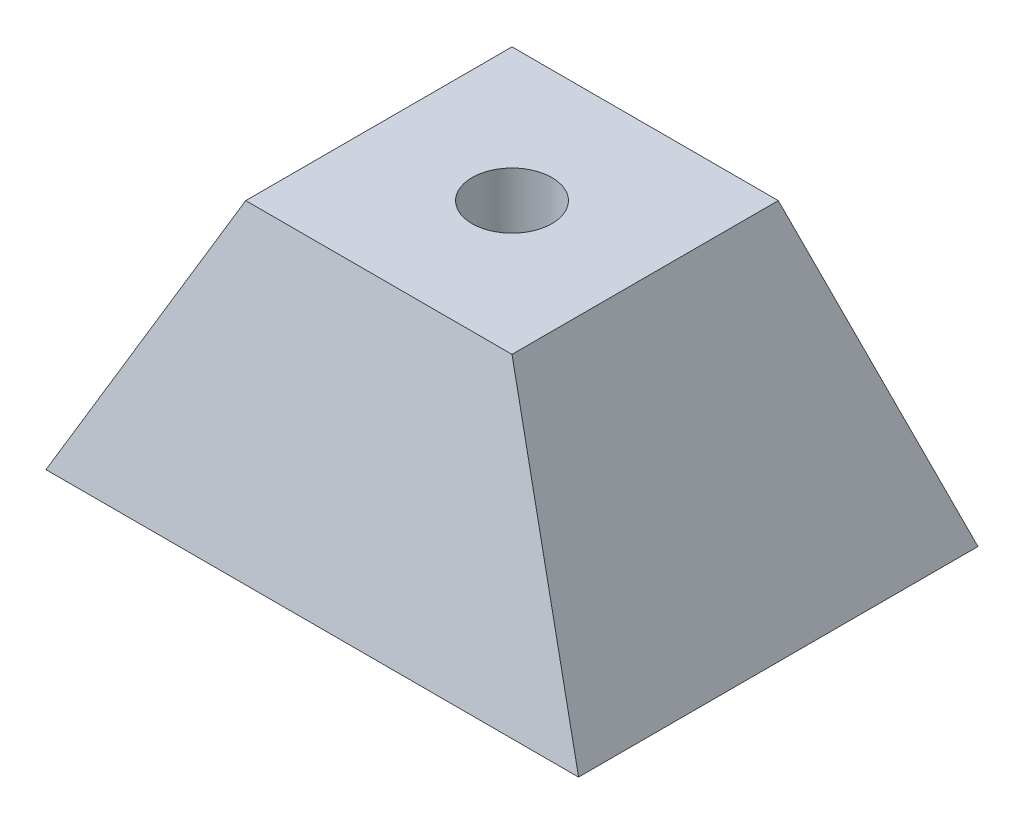
ISO-10303-21;
HEADER;
FILE_DESCRIPTION(('STEP AP214'),'2;1');
FILE_NAME('part.step','',(''),(''),'','','');
FILE_SCHEMA(('AUTOMOTIVE_DESIGN { 1 0 10303 214 1 1 1 1 }'));
ENDSEC;
DATA;
#1=APPLICATION_CONTEXT('core data for automotive mechanical design processes');
#2=APPLICATION_PROTOCOL_DEFINITION('international standard','automotive_design',2000,#1);
#3=PRODUCT_CONTEXT('',#1,'mechanical');
#4=PRODUCT('Part','Part','',(#3));
#5=PRODUCT_RELATED_PRODUCT_CATEGORY('part','',(#4));
#6=PRODUCT_DEFINITION_FORMATION('','',#4);
#7=PRODUCT_DEFINITION_CONTEXT('part definition',#1,'design');
#8=PRODUCT_DEFINITION('design','',#6,#7);
#9=PRODUCT_DEFINITION_SHAPE('','',#8);
#10=(LENGTH_UNIT() NAMED_UNIT(*) SI_UNIT(.MILLI.,.METRE.));
#11=(NAMED_UNIT(*) PLANE_ANGLE_UNIT() SI_UNIT($,.RADIAN.));
#12=(NAMED_UNIT(*) SI_UNIT($,.STERADIAN.) SOLID_ANGLE_UNIT());
#13=UNCERTAINTY_MEASURE_WITH_UNIT(LENGTH_MEASURE(1.E-05),#10,'distance_accuracy_value','');
#14=(GEOMETRIC_REPRESENTATION_CONTEXT(3) GLOBAL_UNCERTAINTY_ASSIGNED_CONTEXT((#13)) GLOBAL_UNIT_ASSIGNED_CONTEXT((#10,
#11,#12)) REPRESENTATION_CONTEXT('',''));
#15=CARTESIAN_POINT('',(0.,0.,0.));
#16=DIRECTION('',(0.,0.,1.));
#17=DIRECTION('',(1.,0.,0.));
#18=AXIS2_PLACEMENT_3D('',#15,#16,#17);
#19=CARTESIAN_POINT('',(0.,0.,0.));
#20=DIRECTION('',(0.,-1.,0.));
#21=DIRECTION('',(0.,0.,-1.));
#22=AXIS2_PLACEMENT_3D('',#19,#20,#21);
#23=PLANE('',#22);
#24=CARTESIAN_POINT('',(0.,0.,0.));
#25=DIRECTION('',(0.,-1.,0.));
#26=DIRECTION('',(0.,0.,-1.));
#27=AXIS2_PLACEMENT_3D('',#24,#25,#26);
#28=CIRCLE('',#27,1.905);
#29=CARTESIAN_POINT('',(0.,0.,-1.905));
#30=VERTEX_POINT('',#29);
#31=EDGE_CURVE('E279',#30,#30,#28,.T.);
#32=ORIENTED_EDGE('',*,*,#31,.F.);
#33=EDGE_LOOP('',(#32));
#34=FACE_BOUND('',#33,.T.);
#35=DIRECTION('',(0.,0.,-1.));
#36=VECTOR('',#35,1.);
#37=CARTESIAN_POINT('',(12.7,0.,9.525));
#38=LINE('',#37,#36);
#39=CARTESIAN_POINT('',(12.7,0.,9.525));
#40=VERTEX_POINT('',#39);
#41=CARTESIAN_POINT('',(12.7,0.,-9.525));
#42=VERTEX_POINT('',#41);
#43=EDGE_CURVE('E170',#40,#42,#38,.T.);
#44=ORIENTED_EDGE('',*,*,#43,.F.);
#45=DIRECTION('',(1.,0.,0.));
#46=VECTOR('',#45,1.);
#47=CARTESIAN_POINT('',(-12.7,0.,9.525));
#48=LINE('',#47,#46);
#49=CARTESIAN_POINT('',(-12.7,0.,9.525));
#50=VERTEX_POINT('',#49);
#51=EDGE_CURVE('E12',#50,#40,#48,.T.);
#52=ORIENTED_EDGE('',*,*,#51,.F.);
#53=DIRECTION('',(0.,0.,1.));
#54=VECTOR('',#53,1.);
#55=CARTESIAN_POINT('',(-12.7,0.,9.525));
#56=LINE('',#55,#54);
#57=CARTESIAN_POINT('',(-12.7,0.,-9.525));
#58=VERTEX_POINT('',#57);
#59=EDGE_CURVE('E57',#58,#50,#56,.T.);
#60=ORIENTED_EDGE('',*,*,#59,.F.);
#61=DIRECTION('',(-1.,0.,0.));
#62=VECTOR('',#61,1.);
#63=CARTESIAN_POINT('',(-12.7,0.,-9.525));
#64=LINE('',#63,#62);
#65=EDGE_CURVE('E190',#42,#58,#64,.T.);
#66=ORIENTED_EDGE('',*,*,#65,.F.);
#67=EDGE_LOOP('',(#44,#52,#60,#66));
#68=FACE_BOUND('',#67,.T.);
#69=ADVANCED_FACE('F47',(#34,#68),#23,.T.);
#70=CARTESIAN_POINT('',(0.,12.7,0.));
#71=DIRECTION('',(0.,-1.,0.));
#72=DIRECTION('',(0.,0.,-1.));
#73=AXIS2_PLACEMENT_3D('',#70,#71,#72);
#74=PLANE('',#73);
#75=CARTESIAN_POINT('',(0.,12.7,0.));
#76=DIRECTION('',(0.,1.,0.));
#77=DIRECTION('',(0.,0.,1.));
#78=AXIS2_PLACEMENT_3D('',#75,#76,#77);
#79=CIRCLE('',#78,1.905);
#80=CARTESIAN_POINT('',(0.,12.7,1.905));
#81=VERTEX_POINT('',#80);
#82=EDGE_CURVE('E281',#81,#81,#79,.T.);
#83=ORIENTED_EDGE('',*,*,#82,.F.);
#84=EDGE_LOOP('',(#83));
#85=FACE_BOUND('',#84,.T.);
#86=DIRECTION('',(0.,0.,-1.));
#87=VECTOR('',#86,1.);
#88=CARTESIAN_POINT('',(6.35,12.7,6.35));
#89=LINE('',#88,#87);
#90=CARTESIAN_POINT('',(6.35,12.7,6.35));
#91=VERTEX_POINT('',#90);
#92=CARTESIAN_POINT('',(6.35,12.7,-6.35));
#93=VERTEX_POINT('',#92);
#94=EDGE_CURVE('E158',#91,#93,#89,.T.);
#95=ORIENTED_EDGE('',*,*,#94,.T.);
#96=DIRECTION('',(-1.,0.,0.));
#97=VECTOR('',#96,1.);
#98=CARTESIAN_POINT('',(-6.35,12.7,-6.35));
#99=LINE('',#98,#97);
#100=CARTESIAN_POINT('',(-6.35,12.7,-6.35));
#101=VERTEX_POINT('',#100);
#102=EDGE_CURVE('E116',#93,#101,#99,.T.);
#103=ORIENTED_EDGE('',*,*,#102,.T.);
#104=DIRECTION('',(0.,0.,1.));
#105=VECTOR('',#104,1.);
#106=CARTESIAN_POINT('',(-6.35,12.7,6.35));
#107=LINE('',#106,#105);
#108=CARTESIAN_POINT('',(-6.35,12.7,6.35));
#109=VERTEX_POINT('',#108);
#110=EDGE_CURVE('E96',#101,#109,#107,.T.);
#111=ORIENTED_EDGE('',*,*,#110,.T.);
#112=DIRECTION('',(1.,0.,0.));
#113=VECTOR('',#112,1.);
#114=CARTESIAN_POINT('',(-6.35,12.7,6.35));
#115=LINE('',#114,#113);
#116=EDGE_CURVE('E104',#109,#91,#115,.T.);
#117=ORIENTED_EDGE('',*,*,#116,.T.);
#118=EDGE_LOOP('',(#95,#103,#111,#117));
#119=FACE_BOUND('',#118,.T.);
#120=ADVANCED_FACE('F115',(#85,#119),#74,.F.);
#121=CARTESIAN_POINT('',(-10.16,5.08,0.));
#122=DIRECTION('',(-0.894427190999916,0.447213595499958,0.));
#123=DIRECTION('',(-0.447213595499958,-0.894427190999916,0.));
#124=AXIS2_PLACEMENT_3D('',#121,#122,#123);
#125=PLANE('',#124);
#126=DIRECTION('',(-0.436435780471985,-0.87287156094397,-0.218217890235993));
#127=VECTOR('',#126,1.);
#128=CARTESIAN_POINT('',(-6.35,12.7,-6.35));
#129=LINE('',#128,#127);
#130=EDGE_CURVE('E102',#101,#58,#129,.T.);
#131=ORIENTED_EDGE('',*,*,#130,.T.);
#132=ORIENTED_EDGE('',*,*,#59,.T.);
#133=DIRECTION('',(-0.436435780471985,-0.87287156094397,0.218217890235992));
#134=VECTOR('',#133,1.);
#135=CARTESIAN_POINT('',(-6.35,12.7,6.35));
#136=LINE('',#135,#134);
#137=EDGE_CURVE('E91',#109,#50,#136,.T.);
#138=ORIENTED_EDGE('',*,*,#137,.F.);
#139=ORIENTED_EDGE('',*,*,#110,.F.);
#140=EDGE_LOOP('',(#131,#132,#138,#139));
#141=FACE_BOUND('',#140,.T.);
#142=ADVANCED_FACE('F94',(#141),#125,.T.);
#143=CARTESIAN_POINT('',(0.,2.24117647058823,8.96470588235294));
#144=DIRECTION('',(0.,0.242535625036333,0.970142500145332));
#145=DIRECTION('',(0.,-0.970142500145332,0.242535625036333));
#146=AXIS2_PLACEMENT_3D('',#143,#144,#145);
#147=PLANE('',#146);
#148=ORIENTED_EDGE('',*,*,#137,.T.);
#149=ORIENTED_EDGE('',*,*,#51,.T.);
#150=DIRECTION('',(0.436435780471985,-0.872871560943969,0.218217890235992));
#151=VECTOR('',#150,1.);
#152=CARTESIAN_POINT('',(6.35,12.7,6.35));
#153=LINE('',#152,#151);
#154=EDGE_CURVE('E65',#91,#40,#153,.T.);
#155=ORIENTED_EDGE('',*,*,#154,.F.);
#156=ORIENTED_EDGE('',*,*,#116,.F.);
#157=EDGE_LOOP('',(#148,#149,#155,#156));
#158=FACE_BOUND('',#157,.T.);
#159=ADVANCED_FACE('F106',(#158),#147,.T.);
#160=CARTESIAN_POINT('',(0.,2.24117647058824,-8.96470588235294));
#161=DIRECTION('',(0.,0.242535625036333,-0.970142500145332));
#162=DIRECTION('',(0.,0.970142500145332,0.242535625036333));
#163=AXIS2_PLACEMENT_3D('',#160,#161,#162);
#164=PLANE('',#163);
#165=DIRECTION('',(0.436435780471985,-0.872871560943969,-0.218217890235993));
#166=VECTOR('',#165,1.);
#167=CARTESIAN_POINT('',(6.35,12.7,-6.35));
#168=LINE('',#167,#166);
#169=EDGE_CURVE('E101',#93,#42,#168,.T.);
#170=ORIENTED_EDGE('',*,*,#169,.T.);
#171=ORIENTED_EDGE('',*,*,#65,.T.);
#172=ORIENTED_EDGE('',*,*,#130,.F.);
#173=ORIENTED_EDGE('',*,*,#102,.F.);
#174=EDGE_LOOP('',(#170,#171,#172,#173));
#175=FACE_BOUND('',#174,.T.);
#176=ADVANCED_FACE('F221',(#175),#164,.T.);
#177=CARTESIAN_POINT('',(10.16,5.08,0.));
#178=DIRECTION('',(0.894427190999916,0.447213595499958,0.));
#179=DIRECTION('',(-0.447213595499958,0.894427190999916,0.));
#180=AXIS2_PLACEMENT_3D('',#177,#178,#179);
#181=PLANE('',#180);
#182=ORIENTED_EDGE('',*,*,#154,.T.);
#183=ORIENTED_EDGE('',*,*,#43,.T.);
#184=ORIENTED_EDGE('',*,*,#169,.F.);
#185=ORIENTED_EDGE('',*,*,#94,.F.);
#186=EDGE_LOOP('',(#182,#183,#184,#185));
#187=FACE_BOUND('',#186,.T.);
#188=ADVANCED_FACE('F229',(#187),#181,.T.);
#189=CARTESIAN_POINT('',(0.,-0.000100000000002876,0.));
#190=DIRECTION('',(0.,1.,0.));
#191=DIRECTION('',(0.,0.,1.));
#192=AXIS2_PLACEMENT_3D('',#189,#190,#191);
#193=CYLINDRICAL_SURFACE('',#192,1.905);
#194=ORIENTED_EDGE('',*,*,#31,.T.);
#195=EDGE_LOOP('',(#194));
#196=FACE_BOUND('',#195,.T.);
#197=ORIENTED_EDGE('',*,*,#82,.T.);
#198=EDGE_LOOP('',(#197));
#199=FACE_BOUND('',#198,.T.);
#200=ADVANCED_FACE('F137',(#196,#199),#193,.F.);
#201=CLOSED_SHELL('',(#69,#120,#142,#159,#176,#188,#200));
#202=MANIFOLD_SOLID_BREP('B2',#201);
#203=ADVANCED_BREP_SHAPE_REPRESENTATION('',(#18,#202),#14);
#204=SHAPE_DEFINITION_REPRESENTATION(#9,#203);
ENDSEC;
END-ISO-10303-21;
